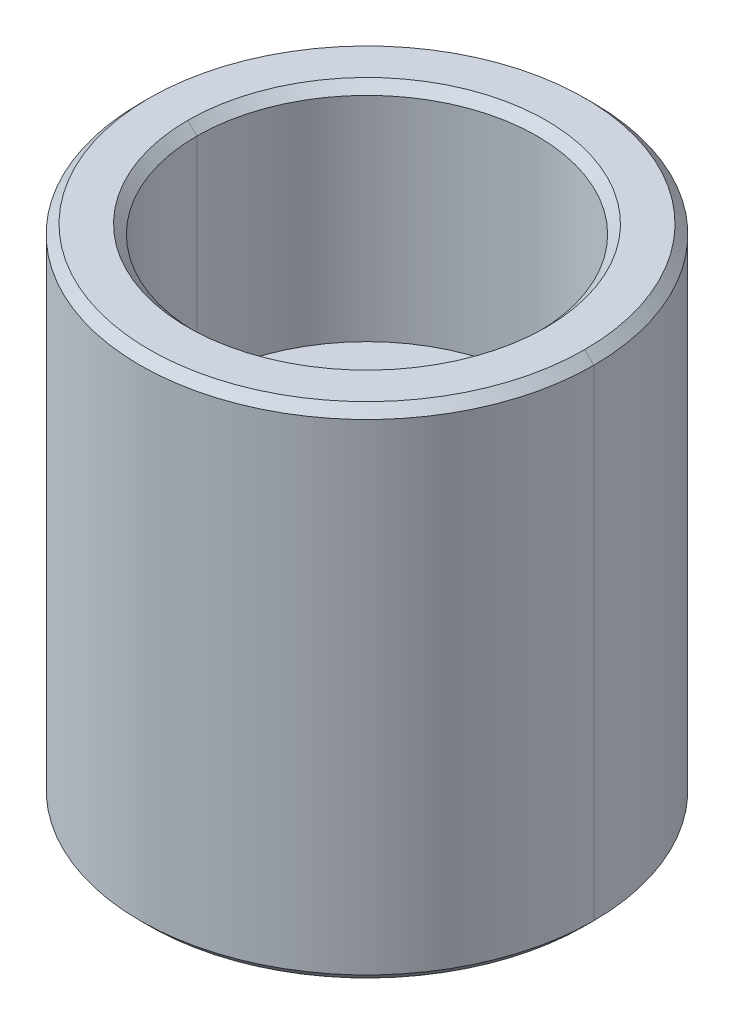
ISO-10303-21;
HEADER;
FILE_DESCRIPTION(('STEP AP214'),'2;1');
FILE_NAME('part.step','',(''),(''),'','','');
FILE_SCHEMA(('AUTOMOTIVE_DESIGN { 1 0 10303 214 1 1 1 1 }'));
ENDSEC;
DATA;
#1=APPLICATION_CONTEXT('core data for automotive mechanical design processes');
#2=APPLICATION_PROTOCOL_DEFINITION('international standard','automotive_design',2000,#1);
#3=PRODUCT_CONTEXT('',#1,'mechanical');
#4=PRODUCT('Part','Part','',(#3));
#5=PRODUCT_RELATED_PRODUCT_CATEGORY('part','',(#4));
#6=PRODUCT_DEFINITION_FORMATION('','',#4);
#7=PRODUCT_DEFINITION_CONTEXT('part definition',#1,'design');
#8=PRODUCT_DEFINITION('design','',#6,#7);
#9=PRODUCT_DEFINITION_SHAPE('','',#8);
#10=(LENGTH_UNIT() NAMED_UNIT(*) SI_UNIT(.MILLI.,.METRE.));
#11=(NAMED_UNIT(*) PLANE_ANGLE_UNIT() SI_UNIT($,.RADIAN.));
#12=(NAMED_UNIT(*) SI_UNIT($,.STERADIAN.) SOLID_ANGLE_UNIT());
#13=UNCERTAINTY_MEASURE_WITH_UNIT(LENGTH_MEASURE(1.E-05),#10,'distance_accuracy_value','');
#14=(GEOMETRIC_REPRESENTATION_CONTEXT(3) GLOBAL_UNCERTAINTY_ASSIGNED_CONTEXT((#13)) GLOBAL_UNIT_ASSIGNED_CONTEXT((#10,
#11,#12)) REPRESENTATION_CONTEXT('',''));
#15=CARTESIAN_POINT('',(0.,0.,0.));
#16=DIRECTION('',(0.,0.,1.));
#17=DIRECTION('',(1.,0.,0.));
#18=AXIS2_PLACEMENT_3D('',#15,#16,#17);
#19=CARTESIAN_POINT('',(0.,0.1,0.));
#20=DIRECTION('',(0.,1.,0.));
#21=DIRECTION('',(1.,0.,0.));
#22=AXIS2_PLACEMENT_3D('',#19,#20,#21);
#23=CONICAL_SURFACE('',#22,4.9,0.7853981633973);
#24=DIRECTION('',(-0.707106781186548,-0.707106781186548,0.));
#25=VECTOR('',#24,1.);
#26=CARTESIAN_POINT('',(5.,0.2,0.));
#27=LINE('',#26,#25);
#28=CARTESIAN_POINT('',(5.,0.2,0.));
#29=VERTEX_POINT('',#28);
#30=CARTESIAN_POINT('',(4.8,0.,0.));
#31=VERTEX_POINT('',#30);
#32=EDGE_CURVE('E169',#29,#31,#27,.T.);
#33=ORIENTED_EDGE('',*,*,#32,.T.);
#34=CARTESIAN_POINT('',(0.,0.,0.));
#35=DIRECTION('',(0.,1.,0.));
#36=DIRECTION('',(1.,0.,0.));
#37=AXIS2_PLACEMENT_3D('',#34,#35,#36);
#38=CIRCLE('',#37,4.8);
#39=CARTESIAN_POINT('',(-4.8,0.,0.));
#40=VERTEX_POINT('',#39);
#41=EDGE_CURVE('E158',#31,#40,#38,.T.);
#42=ORIENTED_EDGE('',*,*,#41,.T.);
#43=DIRECTION('',(0.707106781186548,-0.707106781186548,0.));
#44=VECTOR('',#43,1.);
#45=CARTESIAN_POINT('',(-5.,0.2,0.));
#46=LINE('',#45,#44);
#47=CARTESIAN_POINT('',(-5.,0.2,0.));
#48=VERTEX_POINT('',#47);
#49=EDGE_CURVE('E162',#48,#40,#46,.T.);
#50=ORIENTED_EDGE('',*,*,#49,.F.);
#51=CARTESIAN_POINT('',(0.,0.2,0.));
#52=DIRECTION('',(0.,1.,0.));
#53=DIRECTION('',(1.,0.,0.));
#54=AXIS2_PLACEMENT_3D('',#51,#52,#53);
#55=CIRCLE('',#54,5.);
#56=EDGE_CURVE('E212',#29,#48,#55,.T.);
#57=ORIENTED_EDGE('',*,*,#56,.F.);
#58=EDGE_LOOP('',(#33,#42,#50,#57));
#59=FACE_BOUND('',#58,.T.);
#60=ADVANCED_FACE('F16',(#59),#23,.T.);
#61=CARTESIAN_POINT('',(0.,10.9,0.));
#62=DIRECTION('',(0.,-1.,0.));
#63=DIRECTION('',(-1.,0.,0.));
#64=AXIS2_PLACEMENT_3D('',#61,#62,#63);
#65=CONICAL_SURFACE('',#64,4.9,0.7853981633973);
#66=DIRECTION('',(-0.707106781186548,-0.707106781186548,0.));
#67=VECTOR('',#66,1.);
#68=CARTESIAN_POINT('',(-4.8,11.,0.));
#69=LINE('',#68,#67);
#70=CARTESIAN_POINT('',(-4.8,11.,0.));
#71=VERTEX_POINT('',#70);
#72=CARTESIAN_POINT('',(-5.,10.8,0.));
#73=VERTEX_POINT('',#72);
#74=EDGE_CURVE('E200',#71,#73,#69,.T.);
#75=ORIENTED_EDGE('',*,*,#74,.T.);
#76=CARTESIAN_POINT('',(0.,10.8,0.));
#77=DIRECTION('',(0.,-1.,0.));
#78=DIRECTION('',(1.,0.,0.));
#79=AXIS2_PLACEMENT_3D('',#76,#77,#78);
#80=CIRCLE('',#79,5.);
#81=CARTESIAN_POINT('',(5.,10.8,0.));
#82=VERTEX_POINT('',#81);
#83=EDGE_CURVE('E177',#82,#73,#80,.T.);
#84=ORIENTED_EDGE('',*,*,#83,.F.);
#85=DIRECTION('',(0.707106781186548,-0.707106781186548,0.));
#86=VECTOR('',#85,1.);
#87=CARTESIAN_POINT('',(4.8,11.,0.));
#88=LINE('',#87,#86);
#89=CARTESIAN_POINT('',(4.8,11.,0.));
#90=VERTEX_POINT('',#89);
#91=EDGE_CURVE('E211',#90,#82,#88,.T.);
#92=ORIENTED_EDGE('',*,*,#91,.F.);
#93=CARTESIAN_POINT('',(0.,11.,0.));
#94=DIRECTION('',(0.,-1.,0.));
#95=DIRECTION('',(1.,0.,0.));
#96=AXIS2_PLACEMENT_3D('',#93,#94,#95);
#97=CIRCLE('',#96,4.8);
#98=EDGE_CURVE('E199',#90,#71,#97,.T.);
#99=ORIENTED_EDGE('',*,*,#98,.T.);
#100=EDGE_LOOP('',(#75,#84,#92,#99));
#101=FACE_BOUND('',#100,.T.);
#102=ADVANCED_FACE('F261',(#101),#65,.T.);
#103=CARTESIAN_POINT('',(0.,10.9,0.));
#104=DIRECTION('',(0.,1.,0.));
#105=DIRECTION('',(1.,0.,0.));
#106=AXIS2_PLACEMENT_3D('',#103,#104,#105);
#107=CONICAL_SURFACE('',#106,3.85,0.7853981633973);
#108=DIRECTION('',(0.707106781186548,0.707106781186548,0.));
#109=VECTOR('',#108,1.);
#110=CARTESIAN_POINT('',(3.75,10.8,0.));
#111=LINE('',#110,#109);
#112=CARTESIAN_POINT('',(3.75,10.8,0.));
#113=VERTEX_POINT('',#112);
#114=CARTESIAN_POINT('',(3.95,11.,0.));
#115=VERTEX_POINT('',#114);
#116=EDGE_CURVE('E143',#113,#115,#111,.T.);
#117=ORIENTED_EDGE('',*,*,#116,.T.);
#118=CARTESIAN_POINT('',(0.,11.,0.));
#119=DIRECTION('',(0.,1.,0.));
#120=DIRECTION('',(1.,0.,0.));
#121=AXIS2_PLACEMENT_3D('',#118,#119,#120);
#122=CIRCLE('',#121,3.95);
#123=CARTESIAN_POINT('',(-3.95,11.,0.));
#124=VERTEX_POINT('',#123);
#125=EDGE_CURVE('E20',#115,#124,#122,.T.);
#126=ORIENTED_EDGE('',*,*,#125,.T.);
#127=DIRECTION('',(-0.707106781186548,0.707106781186548,0.));
#128=VECTOR('',#127,1.);
#129=CARTESIAN_POINT('',(-3.75,10.8,0.));
#130=LINE('',#129,#128);
#131=CARTESIAN_POINT('',(-3.75,10.8,0.));
#132=VERTEX_POINT('',#131);
#133=EDGE_CURVE('E150',#132,#124,#130,.T.);
#134=ORIENTED_EDGE('',*,*,#133,.F.);
#135=CARTESIAN_POINT('',(0.,10.8,0.));
#136=DIRECTION('',(0.,1.,0.));
#137=DIRECTION('',(1.,0.,0.));
#138=AXIS2_PLACEMENT_3D('',#135,#136,#137);
#139=CIRCLE('',#138,3.75);
#140=EDGE_CURVE('E134',#113,#132,#139,.T.);
#141=ORIENTED_EDGE('',*,*,#140,.F.);
#142=EDGE_LOOP('',(#117,#126,#134,#141));
#143=FACE_BOUND('',#142,.T.);
#144=ADVANCED_FACE('F313',(#143),#107,.F.);
#145=CARTESIAN_POINT('',(0.,6.,0.));
#146=DIRECTION('',(0.,1.,0.));
#147=DIRECTION('',(1.,0.,0.));
#148=AXIS2_PLACEMENT_3D('',#145,#146,#147);
#149=CONICAL_SURFACE('',#148,2.1,0.7853981633973);
#150=DIRECTION('',(0.707106781186548,0.707106781186548,0.));
#151=VECTOR('',#150,1.);
#152=CARTESIAN_POINT('',(2.,5.9,0.));
#153=LINE('',#152,#151);
#154=CARTESIAN_POINT('',(2.,5.9,0.));
#155=VERTEX_POINT('',#154);
#156=CARTESIAN_POINT('',(2.2,6.1,0.));
#157=VERTEX_POINT('',#156);
#158=EDGE_CURVE('E105',#155,#157,#153,.T.);
#159=ORIENTED_EDGE('',*,*,#158,.T.);
#160=CARTESIAN_POINT('',(0.,6.1,0.));
#161=DIRECTION('',(0.,1.,0.));
#162=DIRECTION('',(1.,0.,0.));
#163=AXIS2_PLACEMENT_3D('',#160,#161,#162);
#164=CIRCLE('',#163,2.2);
#165=CARTESIAN_POINT('',(-2.2,6.1,0.));
#166=VERTEX_POINT('',#165);
#167=EDGE_CURVE('E110',#157,#166,#164,.T.);
#168=ORIENTED_EDGE('',*,*,#167,.T.);
#169=DIRECTION('',(-0.707106781186548,0.707106781186548,0.));
#170=VECTOR('',#169,1.);
#171=CARTESIAN_POINT('',(-2.,5.9,0.));
#172=LINE('',#171,#170);
#173=CARTESIAN_POINT('',(-2.,5.9,0.));
#174=VERTEX_POINT('',#173);
#175=EDGE_CURVE('E117',#174,#166,#172,.T.);
#176=ORIENTED_EDGE('',*,*,#175,.F.);
#177=CARTESIAN_POINT('',(0.,5.9,0.));
#178=DIRECTION('',(0.,1.,0.));
#179=DIRECTION('',(1.,0.,0.));
#180=AXIS2_PLACEMENT_3D('',#177,#178,#179);
#181=CIRCLE('',#180,2.);
#182=EDGE_CURVE('E111',#155,#174,#181,.T.);
#183=ORIENTED_EDGE('',*,*,#182,.F.);
#184=EDGE_LOOP('',(#159,#168,#176,#183));
#185=FACE_BOUND('',#184,.T.);
#186=ADVANCED_FACE('F107',(#185),#149,.F.);
#187=CARTESIAN_POINT('',(0.,0.1,0.));
#188=DIRECTION('',(0.,-1.,0.));
#189=DIRECTION('',(-1.,0.,0.));
#190=AXIS2_PLACEMENT_3D('',#187,#188,#189);
#191=CONICAL_SURFACE('',#190,2.1,0.7853981633973);
#192=DIRECTION('',(0.707106781186548,0.707106781186548,0.));
#193=VECTOR('',#192,1.);
#194=CARTESIAN_POINT('',(-2.2,0.,0.));
#195=LINE('',#194,#193);
#196=CARTESIAN_POINT('',(-2.2,0.,0.));
#197=VERTEX_POINT('',#196);
#198=CARTESIAN_POINT('',(-2.,0.2,0.));
#199=VERTEX_POINT('',#198);
#200=EDGE_CURVE('E11',#197,#199,#195,.T.);
#201=ORIENTED_EDGE('',*,*,#200,.T.);
#202=CARTESIAN_POINT('',(0.,0.2,0.));
#203=DIRECTION('',(0.,-1.,0.));
#204=DIRECTION('',(1.,0.,0.));
#205=AXIS2_PLACEMENT_3D('',#202,#203,#204);
#206=CIRCLE('',#205,2.);
#207=CARTESIAN_POINT('',(2.,0.2,0.));
#208=VERTEX_POINT('',#207);
#209=EDGE_CURVE('E182',#208,#199,#206,.T.);
#210=ORIENTED_EDGE('',*,*,#209,.F.);
#211=DIRECTION('',(-0.707106781186548,0.707106781186548,0.));
#212=VECTOR('',#211,1.);
#213=CARTESIAN_POINT('',(2.2,0.,0.));
#214=LINE('',#213,#212);
#215=CARTESIAN_POINT('',(2.2,0.,0.));
#216=VERTEX_POINT('',#215);
#217=EDGE_CURVE('E27',#216,#208,#214,.T.);
#218=ORIENTED_EDGE('',*,*,#217,.F.);
#219=CARTESIAN_POINT('',(0.,0.,0.));
#220=DIRECTION('',(0.,-1.,0.));
#221=DIRECTION('',(1.,0.,0.));
#222=AXIS2_PLACEMENT_3D('',#219,#220,#221);
#223=CIRCLE('',#222,2.2);
#224=EDGE_CURVE('E157',#216,#197,#223,.T.);
#225=ORIENTED_EDGE('',*,*,#224,.T.);
#226=EDGE_LOOP('',(#201,#210,#218,#225));
#227=FACE_BOUND('',#226,.T.);
#228=ADVANCED_FACE('F318',(#227),#191,.F.);
#229=CARTESIAN_POINT('',(0.,0.1,0.));
#230=DIRECTION('',(0.,-1.,0.));
#231=DIRECTION('',(-1.,0.,0.));
#232=AXIS2_PLACEMENT_3D('',#229,#230,#231);
#233=CONICAL_SURFACE('',#232,2.1,0.7853981633973);
#234=ORIENTED_EDGE('',*,*,#217,.T.);
#235=CARTESIAN_POINT('',(0.,0.2,0.));
#236=DIRECTION('',(0.,1.,0.));
#237=DIRECTION('',(1.,0.,0.));
#238=AXIS2_PLACEMENT_3D('',#235,#236,#237);
#239=CIRCLE('',#238,2.);
#240=EDGE_CURVE('E194',#208,#199,#239,.T.);
#241=ORIENTED_EDGE('',*,*,#240,.T.);
#242=ORIENTED_EDGE('',*,*,#200,.F.);
#243=CARTESIAN_POINT('',(0.,0.,0.));
#244=DIRECTION('',(0.,1.,0.));
#245=DIRECTION('',(1.,0.,0.));
#246=AXIS2_PLACEMENT_3D('',#243,#244,#245);
#247=CIRCLE('',#246,2.2);
#248=EDGE_CURVE('E159',#216,#197,#247,.T.);
#249=ORIENTED_EDGE('',*,*,#248,.F.);
#250=EDGE_LOOP('',(#234,#241,#242,#249));
#251=FACE_BOUND('',#250,.T.);
#252=ADVANCED_FACE('F329',(#251),#233,.F.);
#253=CARTESIAN_POINT('',(0.,11.55,0.));
#254=DIRECTION('',(0.,-1.,0.));
#255=DIRECTION('',(-1.,0.,0.));
#256=AXIS2_PLACEMENT_3D('',#253,#254,#255);
#257=CYLINDRICAL_SURFACE('',#256,2.);
#258=ORIENTED_EDGE('',*,*,#182,.T.);
#259=DIRECTION('',(0.,-1.,0.));
#260=VECTOR('',#259,1.);
#261=CARTESIAN_POINT('',(-2.,5.9,0.));
#262=LINE('',#261,#260);
#263=EDGE_CURVE('E186',#174,#199,#262,.T.);
#264=ORIENTED_EDGE('',*,*,#263,.T.);
#265=ORIENTED_EDGE('',*,*,#240,.F.);
#266=DIRECTION('',(0.,-1.,0.));
#267=VECTOR('',#266,1.);
#268=CARTESIAN_POINT('',(2.,5.9,0.));
#269=LINE('',#268,#267);
#270=EDGE_CURVE('E190',#155,#208,#269,.T.);
#271=ORIENTED_EDGE('',*,*,#270,.F.);
#272=EDGE_LOOP('',(#258,#264,#265,#271));
#273=FACE_BOUND('',#272,.T.);
#274=ADVANCED_FACE('F326',(#273),#257,.F.);
#275=CARTESIAN_POINT('',(0.,11.55,0.));
#276=DIRECTION('',(0.,-1.,0.));
#277=DIRECTION('',(-1.,0.,0.));
#278=AXIS2_PLACEMENT_3D('',#275,#276,#277);
#279=CYLINDRICAL_SURFACE('',#278,2.);
#280=ORIENTED_EDGE('',*,*,#209,.T.);
#281=ORIENTED_EDGE('',*,*,#263,.F.);
#282=CARTESIAN_POINT('',(0.,5.9,0.));
#283=DIRECTION('',(0.,-1.,0.));
#284=DIRECTION('',(1.,0.,0.));
#285=AXIS2_PLACEMENT_3D('',#282,#283,#284);
#286=CIRCLE('',#285,2.);
#287=EDGE_CURVE('E116',#155,#174,#286,.T.);
#288=ORIENTED_EDGE('',*,*,#287,.F.);
#289=ORIENTED_EDGE('',*,*,#270,.T.);
#290=EDGE_LOOP('',(#280,#281,#288,#289));
#291=FACE_BOUND('',#290,.T.);
#292=ADVANCED_FACE('F18',(#291),#279,.F.);
#293=CARTESIAN_POINT('',(0.,6.,0.));
#294=DIRECTION('',(0.,1.,0.));
#295=DIRECTION('',(1.,0.,0.));
#296=AXIS2_PLACEMENT_3D('',#293,#294,#295);
#297=CONICAL_SURFACE('',#296,2.1,0.7853981633973);
#298=ORIENTED_EDGE('',*,*,#175,.T.);
#299=CARTESIAN_POINT('',(0.,6.1,0.));
#300=DIRECTION('',(0.,-1.,0.));
#301=DIRECTION('',(1.,0.,0.));
#302=AXIS2_PLACEMENT_3D('',#299,#300,#301);
#303=CIRCLE('',#302,2.2);
#304=EDGE_CURVE('E120',#157,#166,#303,.T.);
#305=ORIENTED_EDGE('',*,*,#304,.F.);
#306=ORIENTED_EDGE('',*,*,#158,.F.);
#307=ORIENTED_EDGE('',*,*,#287,.T.);
#308=EDGE_LOOP('',(#298,#305,#306,#307));
#309=FACE_BOUND('',#308,.T.);
#310=ADVANCED_FACE('F121',(#309),#297,.F.);
#311=CARTESIAN_POINT('',(0.,6.1,0.));
#312=DIRECTION('',(0.,-1.,0.));
#313=DIRECTION('',(0.,0.,-1.));
#314=AXIS2_PLACEMENT_3D('',#311,#312,#313);
#315=PLANE('',#314);
#316=ORIENTED_EDGE('',*,*,#167,.F.);
#317=ORIENTED_EDGE('',*,*,#304,.T.);
#318=EDGE_LOOP('',(#316,#317));
#319=FACE_BOUND('',#318,.T.);
#320=CARTESIAN_POINT('',(0.,6.1,0.));
#321=DIRECTION('',(0.,-1.,0.));
#322=DIRECTION('',(1.,0.,0.));
#323=AXIS2_PLACEMENT_3D('',#320,#321,#322);
#324=CIRCLE('',#323,3.75);
#325=CARTESIAN_POINT('',(3.75,6.1,0.));
#326=VERTEX_POINT('',#325);
#327=CARTESIAN_POINT('',(-3.75,6.1,0.));
#328=VERTEX_POINT('',#327);
#329=EDGE_CURVE('E142',#326,#328,#324,.T.);
#330=ORIENTED_EDGE('',*,*,#329,.F.);
#331=CARTESIAN_POINT('',(0.,6.1,0.));
#332=DIRECTION('',(0.,1.,0.));
#333=DIRECTION('',(1.,0.,0.));
#334=AXIS2_PLACEMENT_3D('',#331,#332,#333);
#335=CIRCLE('',#334,3.75);
#336=EDGE_CURVE('E128',#326,#328,#335,.T.);
#337=ORIENTED_EDGE('',*,*,#336,.T.);
#338=EDGE_LOOP('',(#330,#337));
#339=FACE_BOUND('',#338,.T.);
#340=ADVANCED_FACE('F125',(#319,#339),#315,.F.);
#341=CARTESIAN_POINT('',(0.,11.55,0.));
#342=DIRECTION('',(0.,-1.,0.));
#343=DIRECTION('',(-1.,0.,0.));
#344=AXIS2_PLACEMENT_3D('',#341,#342,#343);
#345=CYLINDRICAL_SURFACE('',#344,3.75);
#346=ORIENTED_EDGE('',*,*,#140,.T.);
#347=DIRECTION('',(0.,-1.,0.));
#348=VECTOR('',#347,1.);
#349=CARTESIAN_POINT('',(-3.75,10.8,0.));
#350=LINE('',#349,#348);
#351=EDGE_CURVE('E144',#132,#328,#350,.T.);
#352=ORIENTED_EDGE('',*,*,#351,.T.);
#353=ORIENTED_EDGE('',*,*,#336,.F.);
#354=DIRECTION('',(0.,-1.,0.));
#355=VECTOR('',#354,1.);
#356=CARTESIAN_POINT('',(3.75,10.8,0.));
#357=LINE('',#356,#355);
#358=EDGE_CURVE('E138',#113,#326,#357,.T.);
#359=ORIENTED_EDGE('',*,*,#358,.F.);
#360=EDGE_LOOP('',(#346,#352,#353,#359));
#361=FACE_BOUND('',#360,.T.);
#362=ADVANCED_FACE('F289',(#361),#345,.F.);
#363=CARTESIAN_POINT('',(0.,11.55,0.));
#364=DIRECTION('',(0.,-1.,0.));
#365=DIRECTION('',(-1.,0.,0.));
#366=AXIS2_PLACEMENT_3D('',#363,#364,#365);
#367=CYLINDRICAL_SURFACE('',#366,3.75);
#368=ORIENTED_EDGE('',*,*,#329,.T.);
#369=ORIENTED_EDGE('',*,*,#351,.F.);
#370=CARTESIAN_POINT('',(0.,10.8,0.));
#371=DIRECTION('',(0.,-1.,0.));
#372=DIRECTION('',(1.,0.,0.));
#373=AXIS2_PLACEMENT_3D('',#370,#371,#372);
#374=CIRCLE('',#373,3.75);
#375=EDGE_CURVE('E139',#113,#132,#374,.T.);
#376=ORIENTED_EDGE('',*,*,#375,.F.);
#377=ORIENTED_EDGE('',*,*,#358,.T.);
#378=EDGE_LOOP('',(#368,#369,#376,#377));
#379=FACE_BOUND('',#378,.T.);
#380=ADVANCED_FACE('F294',(#379),#367,.F.);
#381=CARTESIAN_POINT('',(0.,10.9,0.));
#382=DIRECTION('',(0.,1.,0.));
#383=DIRECTION('',(1.,0.,0.));
#384=AXIS2_PLACEMENT_3D('',#381,#382,#383);
#385=CONICAL_SURFACE('',#384,3.85,0.7853981633973);
#386=ORIENTED_EDGE('',*,*,#133,.T.);
#387=CARTESIAN_POINT('',(0.,11.,0.));
#388=DIRECTION('',(0.,-1.,0.));
#389=DIRECTION('',(1.,0.,0.));
#390=AXIS2_PLACEMENT_3D('',#387,#388,#389);
#391=CIRCLE('',#390,3.95);
#392=EDGE_CURVE('E153',#115,#124,#391,.T.);
#393=ORIENTED_EDGE('',*,*,#392,.F.);
#394=ORIENTED_EDGE('',*,*,#116,.F.);
#395=ORIENTED_EDGE('',*,*,#375,.T.);
#396=EDGE_LOOP('',(#386,#393,#394,#395));
#397=FACE_BOUND('',#396,.T.);
#398=ADVANCED_FACE('F337',(#397),#385,.F.);
#399=CARTESIAN_POINT('',(0.,11.,0.));
#400=DIRECTION('',(0.,-1.,0.));
#401=DIRECTION('',(0.,0.,-1.));
#402=AXIS2_PLACEMENT_3D('',#399,#400,#401);
#403=PLANE('',#402);
#404=ORIENTED_EDGE('',*,*,#125,.F.);
#405=ORIENTED_EDGE('',*,*,#392,.T.);
#406=EDGE_LOOP('',(#404,#405));
#407=FACE_BOUND('',#406,.T.);
#408=ORIENTED_EDGE('',*,*,#98,.F.);
#409=CARTESIAN_POINT('',(0.,11.,0.));
#410=DIRECTION('',(0.,1.,0.));
#411=DIRECTION('',(1.,0.,0.));
#412=AXIS2_PLACEMENT_3D('',#409,#410,#411);
#413=CIRCLE('',#412,4.8);
#414=EDGE_CURVE('E196',#90,#71,#413,.T.);
#415=ORIENTED_EDGE('',*,*,#414,.T.);
#416=EDGE_LOOP('',(#408,#415));
#417=FACE_BOUND('',#416,.T.);
#418=ADVANCED_FACE('F333',(#407,#417),#403,.F.);
#419=CARTESIAN_POINT('',(0.,10.9,0.));
#420=DIRECTION('',(0.,-1.,0.));
#421=DIRECTION('',(-1.,0.,0.));
#422=AXIS2_PLACEMENT_3D('',#419,#420,#421);
#423=CONICAL_SURFACE('',#422,4.9,0.7853981633973);
#424=ORIENTED_EDGE('',*,*,#91,.T.);
#425=CARTESIAN_POINT('',(0.,10.8,0.));
#426=DIRECTION('',(0.,1.,0.));
#427=DIRECTION('',(1.,0.,0.));
#428=AXIS2_PLACEMENT_3D('',#425,#426,#427);
#429=CIRCLE('',#428,5.);
#430=EDGE_CURVE('E207',#82,#73,#429,.T.);
#431=ORIENTED_EDGE('',*,*,#430,.T.);
#432=ORIENTED_EDGE('',*,*,#74,.F.);
#433=ORIENTED_EDGE('',*,*,#414,.F.);
#434=EDGE_LOOP('',(#424,#431,#432,#433));
#435=FACE_BOUND('',#434,.T.);
#436=ADVANCED_FACE('F336',(#435),#423,.T.);
#437=CARTESIAN_POINT('',(0.,11.55,0.));
#438=DIRECTION('',(0.,-1.,0.));
#439=DIRECTION('',(-1.,0.,0.));
#440=AXIS2_PLACEMENT_3D('',#437,#438,#439);
#441=CYLINDRICAL_SURFACE('',#440,5.);
#442=ORIENTED_EDGE('',*,*,#56,.T.);
#443=DIRECTION('',(0.,1.,0.));
#444=VECTOR('',#443,1.);
#445=CARTESIAN_POINT('',(-5.,0.2,0.));
#446=LINE('',#445,#444);
#447=EDGE_CURVE('E180',#48,#73,#446,.T.);
#448=ORIENTED_EDGE('',*,*,#447,.T.);
#449=ORIENTED_EDGE('',*,*,#430,.F.);
#450=DIRECTION('',(0.,1.,0.));
#451=VECTOR('',#450,1.);
#452=CARTESIAN_POINT('',(5.,0.2,0.));
#453=LINE('',#452,#451);
#454=EDGE_CURVE('E229',#29,#82,#453,.T.);
#455=ORIENTED_EDGE('',*,*,#454,.F.);
#456=EDGE_LOOP('',(#442,#448,#449,#455));
#457=FACE_BOUND('',#456,.T.);
#458=ADVANCED_FACE('F253',(#457),#441,.T.);
#459=CARTESIAN_POINT('',(0.,11.55,0.));
#460=DIRECTION('',(0.,-1.,0.));
#461=DIRECTION('',(-1.,0.,0.));
#462=AXIS2_PLACEMENT_3D('',#459,#460,#461);
#463=CYLINDRICAL_SURFACE('',#462,5.);
#464=ORIENTED_EDGE('',*,*,#83,.T.);
#465=ORIENTED_EDGE('',*,*,#447,.F.);
#466=CARTESIAN_POINT('',(0.,0.2,0.));
#467=DIRECTION('',(0.,-1.,0.));
#468=DIRECTION('',(1.,0.,0.));
#469=AXIS2_PLACEMENT_3D('',#466,#467,#468);
#470=CIRCLE('',#469,5.);
#471=EDGE_CURVE('E181',#29,#48,#470,.T.);
#472=ORIENTED_EDGE('',*,*,#471,.F.);
#473=ORIENTED_EDGE('',*,*,#454,.T.);
#474=EDGE_LOOP('',(#464,#465,#472,#473));
#475=FACE_BOUND('',#474,.T.);
#476=ADVANCED_FACE('F258',(#475),#463,.T.);
#477=CARTESIAN_POINT('',(0.,0.1,0.));
#478=DIRECTION('',(0.,1.,0.));
#479=DIRECTION('',(1.,0.,0.));
#480=AXIS2_PLACEMENT_3D('',#477,#478,#479);
#481=CONICAL_SURFACE('',#480,4.9,0.7853981633973);
#482=ORIENTED_EDGE('',*,*,#49,.T.);
#483=CARTESIAN_POINT('',(0.,0.,0.));
#484=DIRECTION('',(0.,-1.,0.));
#485=DIRECTION('',(1.,0.,0.));
#486=AXIS2_PLACEMENT_3D('',#483,#484,#485);
#487=CIRCLE('',#486,4.8);
#488=EDGE_CURVE('E154',#31,#40,#487,.T.);
#489=ORIENTED_EDGE('',*,*,#488,.F.);
#490=ORIENTED_EDGE('',*,*,#32,.F.);
#491=ORIENTED_EDGE('',*,*,#471,.T.);
#492=EDGE_LOOP('',(#482,#489,#490,#491));
#493=FACE_BOUND('',#492,.T.);
#494=ADVANCED_FACE('F323',(#493),#481,.T.);
#495=CARTESIAN_POINT('',(0.,0.,0.));
#496=DIRECTION('',(0.,-1.,0.));
#497=DIRECTION('',(0.,0.,-1.));
#498=AXIS2_PLACEMENT_3D('',#495,#496,#497);
#499=PLANE('',#498);
#500=ORIENTED_EDGE('',*,*,#224,.F.);
#501=ORIENTED_EDGE('',*,*,#248,.T.);
#502=EDGE_LOOP('',(#500,#501));
#503=FACE_BOUND('',#502,.T.);
#504=ORIENTED_EDGE('',*,*,#41,.F.);
#505=ORIENTED_EDGE('',*,*,#488,.T.);
#506=EDGE_LOOP('',(#504,#505));
#507=FACE_BOUND('',#506,.T.);
#508=ADVANCED_FACE('F320',(#503,#507),#499,.T.);
#509=CLOSED_SHELL('',(#60,#102,#144,#186,#228,#252,#274,#292,#310,#340,#362,#380,#398,#418,#436,
#458,#476,#494,#508));
#510=MANIFOLD_SOLID_BREP('B1',#509);
#511=ADVANCED_BREP_SHAPE_REPRESENTATION('',(#18,#510),#14);
#512=SHAPE_DEFINITION_REPRESENTATION(#9,#511);
ENDSEC;
END-ISO-10303-21;
